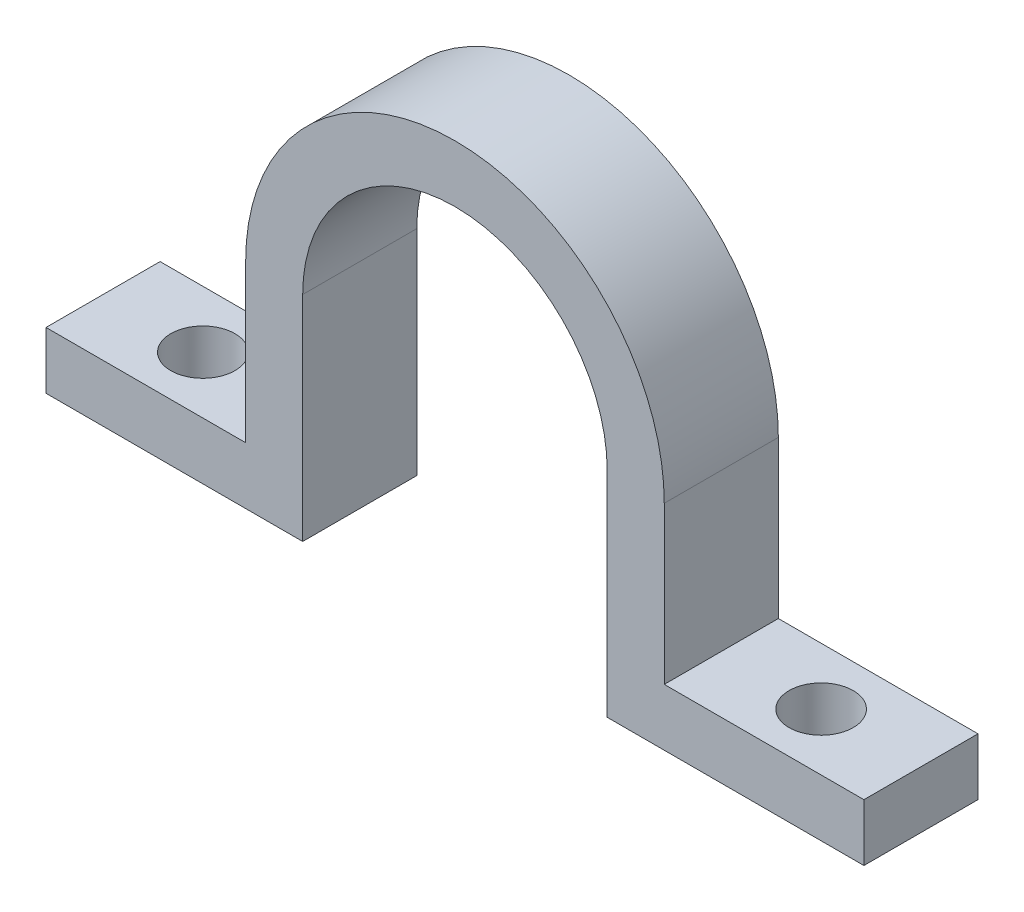
ISO-10303-21;
HEADER;
FILE_DESCRIPTION(('STEP AP214'),'2;1');
FILE_NAME('part.step','',(''),(''),'','','');
FILE_SCHEMA(('AUTOMOTIVE_DESIGN { 1 0 10303 214 1 1 1 1 }'));
ENDSEC;
DATA;
#1=APPLICATION_CONTEXT('core data for automotive mechanical design processes');
#2=APPLICATION_PROTOCOL_DEFINITION('international standard','automotive_design',2000,#1);
#3=PRODUCT_CONTEXT('',#1,'mechanical');
#4=PRODUCT('Part','Part','',(#3));
#5=PRODUCT_RELATED_PRODUCT_CATEGORY('part','',(#4));
#6=PRODUCT_DEFINITION_FORMATION('','',#4);
#7=PRODUCT_DEFINITION_CONTEXT('part definition',#1,'design');
#8=PRODUCT_DEFINITION('design','',#6,#7);
#9=PRODUCT_DEFINITION_SHAPE('','',#8);
#10=(LENGTH_UNIT() NAMED_UNIT(*) SI_UNIT(.MILLI.,.METRE.));
#11=(NAMED_UNIT(*) PLANE_ANGLE_UNIT() SI_UNIT($,.RADIAN.));
#12=(NAMED_UNIT(*) SI_UNIT($,.STERADIAN.) SOLID_ANGLE_UNIT());
#13=UNCERTAINTY_MEASURE_WITH_UNIT(LENGTH_MEASURE(1.E-05),#10,'distance_accuracy_value','');
#14=(GEOMETRIC_REPRESENTATION_CONTEXT(3) GLOBAL_UNCERTAINTY_ASSIGNED_CONTEXT((#13)) GLOBAL_UNIT_ASSIGNED_CONTEXT((#10,
#11,#12)) REPRESENTATION_CONTEXT('',''));
#15=CARTESIAN_POINT('',(0.,0.,0.));
#16=DIRECTION('',(0.,0.,1.));
#17=DIRECTION('',(1.,0.,0.));
#18=AXIS2_PLACEMENT_3D('',#15,#16,#17);
#19=CARTESIAN_POINT('',(-28.6775,4.,4.));
#20=DIRECTION('',(1.,0.,0.));
#21=DIRECTION('',(0.,0.,-1.));
#22=AXIS2_PLACEMENT_3D('',#19,#20,#21);
#23=PLANE('',#22);
#24=DIRECTION('',(0.,-1.,0.));
#25=VECTOR('',#24,1.);
#26=CARTESIAN_POINT('',(-28.6775,4.,-4.));
#27=LINE('',#26,#25);
#28=CARTESIAN_POINT('',(-28.6775,4.,-4.));
#29=VERTEX_POINT('',#28);
#30=CARTESIAN_POINT('',(-28.6775,0.,-4.));
#31=VERTEX_POINT('',#30);
#32=EDGE_CURVE('E175',#29,#31,#27,.T.);
#33=ORIENTED_EDGE('',*,*,#32,.T.);
#34=DIRECTION('',(0.,0.,-1.));
#35=VECTOR('',#34,1.);
#36=CARTESIAN_POINT('',(-28.6775,0.,4.));
#37=LINE('',#36,#35);
#38=CARTESIAN_POINT('',(-28.6775,0.,4.));
#39=VERTEX_POINT('',#38);
#40=EDGE_CURVE('E11',#39,#31,#37,.T.);
#41=ORIENTED_EDGE('',*,*,#40,.F.);
#42=DIRECTION('',(0.,-1.,0.));
#43=VECTOR('',#42,1.);
#44=CARTESIAN_POINT('',(-28.6775,4.,4.));
#45=LINE('',#44,#43);
#46=CARTESIAN_POINT('',(-28.6775,4.,4.));
#47=VERTEX_POINT('',#46);
#48=EDGE_CURVE('E210',#47,#39,#45,.T.);
#49=ORIENTED_EDGE('',*,*,#48,.F.);
#50=DIRECTION('',(0.,0.,-1.));
#51=VECTOR('',#50,1.);
#52=CARTESIAN_POINT('',(-28.6775,4.,4.));
#53=LINE('',#52,#51);
#54=EDGE_CURVE('E169',#47,#29,#53,.T.);
#55=ORIENTED_EDGE('',*,*,#54,.T.);
#56=EDGE_LOOP('',(#33,#41,#49,#55));
#57=FACE_BOUND('',#56,.T.);
#58=ADVANCED_FACE('F44',(#57),#23,.F.);
#59=CARTESIAN_POINT('',(-28.6775,0.,4.));
#60=DIRECTION('',(0.,1.,0.));
#61=DIRECTION('',(0.,0.,1.));
#62=AXIS2_PLACEMENT_3D('',#59,#60,#61);
#63=PLANE('',#62);
#64=CARTESIAN_POINT('',(-21.6775,0.,0.));
#65=DIRECTION('',(0.,1.,0.));
#66=DIRECTION('',(0.,0.,1.));
#67=AXIS2_PLACEMENT_3D('',#64,#65,#66);
#68=CIRCLE('',#67,2.25);
#69=CARTESIAN_POINT('',(-21.6775,0.,2.25));
#70=VERTEX_POINT('',#69);
#71=EDGE_CURVE('E242',#70,#70,#68,.F.);
#72=ORIENTED_EDGE('',*,*,#71,.F.);
#73=EDGE_LOOP('',(#72));
#74=FACE_BOUND('',#73,.T.);
#75=DIRECTION('',(1.,0.,0.));
#76=VECTOR('',#75,1.);
#77=CARTESIAN_POINT('',(-28.6775,0.,-4.));
#78=LINE('',#77,#76);
#79=CARTESIAN_POINT('',(-10.6775,0.,-4.));
#80=VERTEX_POINT('',#79);
#81=EDGE_CURVE('E177',#31,#80,#78,.T.);
#82=ORIENTED_EDGE('',*,*,#81,.T.);
#83=DIRECTION('',(0.,0.,-1.));
#84=VECTOR('',#83,1.);
#85=CARTESIAN_POINT('',(-10.6775,0.,4.));
#86=LINE('',#85,#84);
#87=CARTESIAN_POINT('',(-10.6775,0.,4.));
#88=VERTEX_POINT('',#87);
#89=EDGE_CURVE('E54',#88,#80,#86,.T.);
#90=ORIENTED_EDGE('',*,*,#89,.F.);
#91=DIRECTION('',(1.,0.,0.));
#92=VECTOR('',#91,1.);
#93=CARTESIAN_POINT('',(-28.6775,0.,4.));
#94=LINE('',#93,#92);
#95=EDGE_CURVE('E118',#39,#88,#94,.T.);
#96=ORIENTED_EDGE('',*,*,#95,.F.);
#97=ORIENTED_EDGE('',*,*,#40,.T.);
#98=EDGE_LOOP('',(#82,#90,#96,#97));
#99=FACE_BOUND('',#98,.T.);
#100=ADVANCED_FACE('F309',(#74,#99),#63,.F.);
#101=CARTESIAN_POINT('',(-10.6775,0.,4.));
#102=DIRECTION('',(-1.,0.,0.));
#103=DIRECTION('',(0.,0.,1.));
#104=AXIS2_PLACEMENT_3D('',#101,#102,#103);
#105=PLANE('',#104);
#106=DIRECTION('',(0.,1.,0.));
#107=VECTOR('',#106,1.);
#108=CARTESIAN_POINT('',(-10.6775,0.,-4.));
#109=LINE('',#108,#107);
#110=CARTESIAN_POINT('',(-10.6775,15.,-4.));
#111=VERTEX_POINT('',#110);
#112=EDGE_CURVE('E178',#80,#111,#109,.T.);
#113=ORIENTED_EDGE('',*,*,#112,.T.);
#114=DIRECTION('',(0.,0.,-1.));
#115=VECTOR('',#114,1.);
#116=CARTESIAN_POINT('',(-10.6775,15.,4.));
#117=LINE('',#116,#115);
#118=CARTESIAN_POINT('',(-10.6775,15.,4.));
#119=VERTEX_POINT('',#118);
#120=EDGE_CURVE('E231',#119,#111,#117,.T.);
#121=ORIENTED_EDGE('',*,*,#120,.F.);
#122=DIRECTION('',(0.,1.,0.));
#123=VECTOR('',#122,1.);
#124=CARTESIAN_POINT('',(-10.6775,0.,4.));
#125=LINE('',#124,#123);
#126=EDGE_CURVE('E261',#88,#119,#125,.T.);
#127=ORIENTED_EDGE('',*,*,#126,.F.);
#128=ORIENTED_EDGE('',*,*,#89,.T.);
#129=EDGE_LOOP('',(#113,#121,#127,#128));
#130=FACE_BOUND('',#129,.T.);
#131=ADVANCED_FACE('F312',(#130),#105,.F.);
#132=CARTESIAN_POINT('',(0.,15.,4.));
#133=DIRECTION('',(0.,0.,-1.));
#134=DIRECTION('',(-1.,0.,0.));
#135=AXIS2_PLACEMENT_3D('',#132,#133,#134);
#136=CYLINDRICAL_SURFACE('',#135,10.6775);
#137=CARTESIAN_POINT('',(0.,15.,-4.));
#138=DIRECTION('',(0.,0.,-1.));
#139=DIRECTION('',(-1.,0.,0.));
#140=AXIS2_PLACEMENT_3D('',#137,#138,#139);
#141=CIRCLE('',#140,10.6775);
#142=CARTESIAN_POINT('',(10.6775,15.,-4.));
#143=VERTEX_POINT('',#142);
#144=EDGE_CURVE('E181',#111,#143,#141,.T.);
#145=ORIENTED_EDGE('',*,*,#144,.T.);
#146=DIRECTION('',(0.,0.,-1.));
#147=VECTOR('',#146,1.);
#148=CARTESIAN_POINT('',(10.6775,15.,4.));
#149=LINE('',#148,#147);
#150=CARTESIAN_POINT('',(10.6775,15.,4.));
#151=VERTEX_POINT('',#150);
#152=EDGE_CURVE('E229',#151,#143,#149,.T.);
#153=ORIENTED_EDGE('',*,*,#152,.F.);
#154=CARTESIAN_POINT('',(0.,15.,4.));
#155=DIRECTION('',(0.,0.,-1.));
#156=DIRECTION('',(-1.,0.,0.));
#157=AXIS2_PLACEMENT_3D('',#154,#155,#156);
#158=CIRCLE('',#157,10.6775);
#159=EDGE_CURVE('E262',#119,#151,#158,.T.);
#160=ORIENTED_EDGE('',*,*,#159,.F.);
#161=ORIENTED_EDGE('',*,*,#120,.T.);
#162=EDGE_LOOP('',(#145,#153,#160,#161));
#163=FACE_BOUND('',#162,.T.);
#164=ADVANCED_FACE('F321',(#163),#136,.F.);
#165=CARTESIAN_POINT('',(10.6775,15.,4.));
#166=DIRECTION('',(1.,0.,0.));
#167=DIRECTION('',(0.,0.,-1.));
#168=AXIS2_PLACEMENT_3D('',#165,#166,#167);
#169=PLANE('',#168);
#170=DIRECTION('',(0.,-1.,0.));
#171=VECTOR('',#170,1.);
#172=CARTESIAN_POINT('',(10.6775,15.,-4.));
#173=LINE('',#172,#171);
#174=CARTESIAN_POINT('',(10.6775,0.,-4.));
#175=VERTEX_POINT('',#174);
#176=EDGE_CURVE('E186',#143,#175,#173,.T.);
#177=ORIENTED_EDGE('',*,*,#176,.T.);
#178=DIRECTION('',(0.,0.,-1.));
#179=VECTOR('',#178,1.);
#180=CARTESIAN_POINT('',(10.6775,0.,4.));
#181=LINE('',#180,#179);
#182=CARTESIAN_POINT('',(10.6775,0.,4.));
#183=VERTEX_POINT('',#182);
#184=EDGE_CURVE('E226',#183,#175,#181,.T.);
#185=ORIENTED_EDGE('',*,*,#184,.F.);
#186=DIRECTION('',(0.,-1.,0.));
#187=VECTOR('',#186,1.);
#188=CARTESIAN_POINT('',(10.6775,15.,4.));
#189=LINE('',#188,#187);
#190=EDGE_CURVE('E270',#151,#183,#189,.T.);
#191=ORIENTED_EDGE('',*,*,#190,.F.);
#192=ORIENTED_EDGE('',*,*,#152,.T.);
#193=EDGE_LOOP('',(#177,#185,#191,#192));
#194=FACE_BOUND('',#193,.T.);
#195=ADVANCED_FACE('F330',(#194),#169,.F.);
#196=CARTESIAN_POINT('',(10.6775,0.,4.));
#197=DIRECTION('',(0.,1.,0.));
#198=DIRECTION('',(0.,0.,1.));
#199=AXIS2_PLACEMENT_3D('',#196,#197,#198);
#200=PLANE('',#199);
#201=CARTESIAN_POINT('',(21.6775,0.,0.));
#202=DIRECTION('',(0.,1.,0.));
#203=DIRECTION('',(0.,0.,1.));
#204=AXIS2_PLACEMENT_3D('',#201,#202,#203);
#205=CIRCLE('',#204,2.25);
#206=CARTESIAN_POINT('',(21.6775,0.,2.25));
#207=VERTEX_POINT('',#206);
#208=EDGE_CURVE('E180',#207,#207,#205,.F.);
#209=ORIENTED_EDGE('',*,*,#208,.F.);
#210=EDGE_LOOP('',(#209));
#211=FACE_BOUND('',#210,.T.);
#212=DIRECTION('',(1.,0.,0.));
#213=VECTOR('',#212,1.);
#214=CARTESIAN_POINT('',(10.6775,0.,-4.));
#215=LINE('',#214,#213);
#216=CARTESIAN_POINT('',(28.6775,0.,-4.));
#217=VERTEX_POINT('',#216);
#218=EDGE_CURVE('E188',#175,#217,#215,.T.);
#219=ORIENTED_EDGE('',*,*,#218,.T.);
#220=DIRECTION('',(0.,0.,-1.));
#221=VECTOR('',#220,1.);
#222=CARTESIAN_POINT('',(28.6775,0.,4.));
#223=LINE('',#222,#221);
#224=CARTESIAN_POINT('',(28.6775,0.,4.));
#225=VERTEX_POINT('',#224);
#226=EDGE_CURVE('E225',#225,#217,#223,.T.);
#227=ORIENTED_EDGE('',*,*,#226,.F.);
#228=DIRECTION('',(1.,0.,0.));
#229=VECTOR('',#228,1.);
#230=CARTESIAN_POINT('',(10.6775,0.,4.));
#231=LINE('',#230,#229);
#232=EDGE_CURVE('E269',#183,#225,#231,.T.);
#233=ORIENTED_EDGE('',*,*,#232,.F.);
#234=ORIENTED_EDGE('',*,*,#184,.T.);
#235=EDGE_LOOP('',(#219,#227,#233,#234));
#236=FACE_BOUND('',#235,.T.);
#237=ADVANCED_FACE('F332',(#211,#236),#200,.F.);
#238=CARTESIAN_POINT('',(28.6775,0.,4.));
#239=DIRECTION('',(-1.,0.,0.));
#240=DIRECTION('',(0.,0.,1.));
#241=AXIS2_PLACEMENT_3D('',#238,#239,#240);
#242=PLANE('',#241);
#243=DIRECTION('',(0.,1.,0.));
#244=VECTOR('',#243,1.);
#245=CARTESIAN_POINT('',(28.6775,0.,-4.));
#246=LINE('',#245,#244);
#247=CARTESIAN_POINT('',(28.6775,4.,-4.));
#248=VERTEX_POINT('',#247);
#249=EDGE_CURVE('E195',#217,#248,#246,.T.);
#250=ORIENTED_EDGE('',*,*,#249,.T.);
#251=DIRECTION('',(0.,0.,-1.));
#252=VECTOR('',#251,1.);
#253=CARTESIAN_POINT('',(28.6775,4.,4.));
#254=LINE('',#253,#252);
#255=CARTESIAN_POINT('',(28.6775,4.,4.));
#256=VERTEX_POINT('',#255);
#257=EDGE_CURVE('E217',#256,#248,#254,.T.);
#258=ORIENTED_EDGE('',*,*,#257,.F.);
#259=DIRECTION('',(0.,1.,0.));
#260=VECTOR('',#259,1.);
#261=CARTESIAN_POINT('',(28.6775,0.,4.));
#262=LINE('',#261,#260);
#263=EDGE_CURVE('E272',#225,#256,#262,.T.);
#264=ORIENTED_EDGE('',*,*,#263,.F.);
#265=ORIENTED_EDGE('',*,*,#226,.T.);
#266=EDGE_LOOP('',(#250,#258,#264,#265));
#267=FACE_BOUND('',#266,.T.);
#268=ADVANCED_FACE('F331',(#267),#242,.F.);
#269=CARTESIAN_POINT('',(28.6775,4.,4.));
#270=DIRECTION('',(0.,-1.,0.));
#271=DIRECTION('',(0.,0.,-1.));
#272=AXIS2_PLACEMENT_3D('',#269,#270,#271);
#273=PLANE('',#272);
#274=CARTESIAN_POINT('',(21.6775,4.,0.));
#275=DIRECTION('',(0.,-1.,0.));
#276=DIRECTION('',(0.,0.,-1.));
#277=AXIS2_PLACEMENT_3D('',#274,#275,#276);
#278=CIRCLE('',#277,2.25);
#279=CARTESIAN_POINT('',(21.6775,4.,-2.25));
#280=VERTEX_POINT('',#279);
#281=EDGE_CURVE('E48',#280,#280,#278,.F.);
#282=ORIENTED_EDGE('',*,*,#281,.F.);
#283=EDGE_LOOP('',(#282));
#284=FACE_BOUND('',#283,.T.);
#285=DIRECTION('',(-1.,0.,0.));
#286=VECTOR('',#285,1.);
#287=CARTESIAN_POINT('',(28.6775,4.,-4.));
#288=LINE('',#287,#286);
#289=CARTESIAN_POINT('',(14.6775,4.,-4.));
#290=VERTEX_POINT('',#289);
#291=EDGE_CURVE('E193',#248,#290,#288,.T.);
#292=ORIENTED_EDGE('',*,*,#291,.T.);
#293=DIRECTION('',(0.,0.,-1.));
#294=VECTOR('',#293,1.);
#295=CARTESIAN_POINT('',(14.6775,4.,4.));
#296=LINE('',#295,#294);
#297=CARTESIAN_POINT('',(14.6775,4.,4.));
#298=VERTEX_POINT('',#297);
#299=EDGE_CURVE('E212',#298,#290,#296,.T.);
#300=ORIENTED_EDGE('',*,*,#299,.F.);
#301=DIRECTION('',(-1.,0.,0.));
#302=VECTOR('',#301,1.);
#303=CARTESIAN_POINT('',(28.6775,4.,4.));
#304=LINE('',#303,#302);
#305=EDGE_CURVE('E277',#256,#298,#304,.T.);
#306=ORIENTED_EDGE('',*,*,#305,.F.);
#307=ORIENTED_EDGE('',*,*,#257,.T.);
#308=EDGE_LOOP('',(#292,#300,#306,#307));
#309=FACE_BOUND('',#308,.T.);
#310=ADVANCED_FACE('F283',(#284,#309),#273,.F.);
#311=CARTESIAN_POINT('',(14.6775,4.,4.));
#312=DIRECTION('',(-1.,0.,0.));
#313=DIRECTION('',(0.,0.,1.));
#314=AXIS2_PLACEMENT_3D('',#311,#312,#313);
#315=PLANE('',#314);
#316=DIRECTION('',(0.,1.,0.));
#317=VECTOR('',#316,1.);
#318=CARTESIAN_POINT('',(14.6775,4.,-4.));
#319=LINE('',#318,#317);
#320=CARTESIAN_POINT('',(14.6775,15.,-4.));
#321=VERTEX_POINT('',#320);
#322=EDGE_CURVE('E196',#290,#321,#319,.T.);
#323=ORIENTED_EDGE('',*,*,#322,.T.);
#324=DIRECTION('',(0.,0.,-1.));
#325=VECTOR('',#324,1.);
#326=CARTESIAN_POINT('',(14.6775,15.,4.));
#327=LINE('',#326,#325);
#328=CARTESIAN_POINT('',(14.6775,15.,4.));
#329=VERTEX_POINT('',#328);
#330=EDGE_CURVE('E161',#329,#321,#327,.T.);
#331=ORIENTED_EDGE('',*,*,#330,.F.);
#332=DIRECTION('',(0.,1.,0.));
#333=VECTOR('',#332,1.);
#334=CARTESIAN_POINT('',(14.6775,4.,4.));
#335=LINE('',#334,#333);
#336=EDGE_CURVE('E147',#298,#329,#335,.T.);
#337=ORIENTED_EDGE('',*,*,#336,.F.);
#338=ORIENTED_EDGE('',*,*,#299,.T.);
#339=EDGE_LOOP('',(#323,#331,#337,#338));
#340=FACE_BOUND('',#339,.T.);
#341=ADVANCED_FACE('F289',(#340),#315,.F.);
#342=CARTESIAN_POINT('',(0.,15.,4.));
#343=DIRECTION('',(0.,0.,-1.));
#344=DIRECTION('',(-1.,0.,0.));
#345=AXIS2_PLACEMENT_3D('',#342,#343,#344);
#346=CYLINDRICAL_SURFACE('',#345,14.6775);
#347=CARTESIAN_POINT('',(0.,15.,-4.));
#348=DIRECTION('',(0.,0.,1.));
#349=DIRECTION('',(1.,0.,0.));
#350=AXIS2_PLACEMENT_3D('',#347,#348,#349);
#351=CIRCLE('',#350,14.6775);
#352=CARTESIAN_POINT('',(-14.6775,15.,-4.));
#353=VERTEX_POINT('',#352);
#354=EDGE_CURVE('E157',#321,#353,#351,.T.);
#355=ORIENTED_EDGE('',*,*,#354,.T.);
#356=DIRECTION('',(0.,0.,-1.));
#357=VECTOR('',#356,1.);
#358=CARTESIAN_POINT('',(-14.6775,15.,4.));
#359=LINE('',#358,#357);
#360=CARTESIAN_POINT('',(-14.6775,15.,4.));
#361=VERTEX_POINT('',#360);
#362=EDGE_CURVE('E156',#361,#353,#359,.T.);
#363=ORIENTED_EDGE('',*,*,#362,.F.);
#364=CARTESIAN_POINT('',(0.,15.,4.));
#365=DIRECTION('',(0.,0.,1.));
#366=DIRECTION('',(1.,0.,0.));
#367=AXIS2_PLACEMENT_3D('',#364,#365,#366);
#368=CIRCLE('',#367,14.6775);
#369=EDGE_CURVE('E145',#329,#361,#368,.T.);
#370=ORIENTED_EDGE('',*,*,#369,.F.);
#371=ORIENTED_EDGE('',*,*,#330,.T.);
#372=EDGE_LOOP('',(#355,#363,#370,#371));
#373=FACE_BOUND('',#372,.T.);
#374=ADVANCED_FACE('F160',(#373),#346,.T.);
#375=CARTESIAN_POINT('',(-14.6775,15.,4.));
#376=DIRECTION('',(1.,0.,0.));
#377=DIRECTION('',(0.,0.,-1.));
#378=AXIS2_PLACEMENT_3D('',#375,#376,#377);
#379=PLANE('',#378);
#380=DIRECTION('',(0.,-1.,0.));
#381=VECTOR('',#380,1.);
#382=CARTESIAN_POINT('',(-14.6775,15.,-4.));
#383=LINE('',#382,#381);
#384=CARTESIAN_POINT('',(-14.6775,4.,-4.));
#385=VERTEX_POINT('',#384);
#386=EDGE_CURVE('E104',#353,#385,#383,.T.);
#387=ORIENTED_EDGE('',*,*,#386,.T.);
#388=DIRECTION('',(0.,0.,-1.));
#389=VECTOR('',#388,1.);
#390=CARTESIAN_POINT('',(-14.6775,4.,4.));
#391=LINE('',#390,#389);
#392=CARTESIAN_POINT('',(-14.6775,4.,4.));
#393=VERTEX_POINT('',#392);
#394=EDGE_CURVE('E165',#393,#385,#391,.T.);
#395=ORIENTED_EDGE('',*,*,#394,.F.);
#396=DIRECTION('',(0.,-1.,0.));
#397=VECTOR('',#396,1.);
#398=CARTESIAN_POINT('',(-14.6775,15.,4.));
#399=LINE('',#398,#397);
#400=EDGE_CURVE('E146',#361,#393,#399,.T.);
#401=ORIENTED_EDGE('',*,*,#400,.F.);
#402=ORIENTED_EDGE('',*,*,#362,.T.);
#403=EDGE_LOOP('',(#387,#395,#401,#402));
#404=FACE_BOUND('',#403,.T.);
#405=ADVANCED_FACE('F163',(#404),#379,.F.);
#406=CARTESIAN_POINT('',(-14.6775,4.,4.));
#407=DIRECTION('',(0.,-1.,0.));
#408=DIRECTION('',(0.,0.,-1.));
#409=AXIS2_PLACEMENT_3D('',#406,#407,#408);
#410=PLANE('',#409);
#411=CARTESIAN_POINT('',(-21.6775,4.,0.));
#412=DIRECTION('',(0.,-1.,0.));
#413=DIRECTION('',(0.,0.,-1.));
#414=AXIS2_PLACEMENT_3D('',#411,#412,#413);
#415=CIRCLE('',#414,2.25);
#416=CARTESIAN_POINT('',(-21.6775,4.,-2.25));
#417=VERTEX_POINT('',#416);
#418=EDGE_CURVE('E238',#417,#417,#415,.F.);
#419=ORIENTED_EDGE('',*,*,#418,.F.);
#420=EDGE_LOOP('',(#419));
#421=FACE_BOUND('',#420,.T.);
#422=DIRECTION('',(-1.,0.,0.));
#423=VECTOR('',#422,1.);
#424=CARTESIAN_POINT('',(-14.6775,4.,-4.));
#425=LINE('',#424,#423);
#426=EDGE_CURVE('E112',#385,#29,#425,.T.);
#427=ORIENTED_EDGE('',*,*,#426,.T.);
#428=ORIENTED_EDGE('',*,*,#54,.F.);
#429=DIRECTION('',(-1.,0.,0.));
#430=VECTOR('',#429,1.);
#431=CARTESIAN_POINT('',(-14.6775,4.,4.));
#432=LINE('',#431,#430);
#433=EDGE_CURVE('E63',#393,#47,#432,.T.);
#434=ORIENTED_EDGE('',*,*,#433,.F.);
#435=ORIENTED_EDGE('',*,*,#394,.T.);
#436=EDGE_LOOP('',(#427,#428,#434,#435));
#437=FACE_BOUND('',#436,.T.);
#438=ADVANCED_FACE('F296',(#421,#437),#410,.F.);
#439=CARTESIAN_POINT('',(0.,15.,4.));
#440=DIRECTION('',(0.,0.,-1.));
#441=DIRECTION('',(-1.,0.,0.));
#442=AXIS2_PLACEMENT_3D('',#439,#440,#441);
#443=PLANE('',#442);
#444=ORIENTED_EDGE('',*,*,#48,.T.);
#445=ORIENTED_EDGE('',*,*,#95,.T.);
#446=ORIENTED_EDGE('',*,*,#126,.T.);
#447=ORIENTED_EDGE('',*,*,#159,.T.);
#448=ORIENTED_EDGE('',*,*,#190,.T.);
#449=ORIENTED_EDGE('',*,*,#232,.T.);
#450=ORIENTED_EDGE('',*,*,#263,.T.);
#451=ORIENTED_EDGE('',*,*,#305,.T.);
#452=ORIENTED_EDGE('',*,*,#336,.T.);
#453=ORIENTED_EDGE('',*,*,#369,.T.);
#454=ORIENTED_EDGE('',*,*,#400,.T.);
#455=ORIENTED_EDGE('',*,*,#433,.T.);
#456=EDGE_LOOP('',(#444,#445,#446,#447,#448,#449,#450,#451,#452,#453,#454,#455));
#457=FACE_BOUND('',#456,.T.);
#458=ADVANCED_FACE('F148',(#457),#443,.F.);
#459=CARTESIAN_POINT('',(0.,15.,-4.));
#460=DIRECTION('',(0.,0.,-1.));
#461=DIRECTION('',(-1.,0.,0.));
#462=AXIS2_PLACEMENT_3D('',#459,#460,#461);
#463=PLANE('',#462);
#464=ORIENTED_EDGE('',*,*,#32,.F.);
#465=ORIENTED_EDGE('',*,*,#426,.F.);
#466=ORIENTED_EDGE('',*,*,#386,.F.);
#467=ORIENTED_EDGE('',*,*,#354,.F.);
#468=ORIENTED_EDGE('',*,*,#322,.F.);
#469=ORIENTED_EDGE('',*,*,#291,.F.);
#470=ORIENTED_EDGE('',*,*,#249,.F.);
#471=ORIENTED_EDGE('',*,*,#218,.F.);
#472=ORIENTED_EDGE('',*,*,#176,.F.);
#473=ORIENTED_EDGE('',*,*,#144,.F.);
#474=ORIENTED_EDGE('',*,*,#112,.F.);
#475=ORIENTED_EDGE('',*,*,#81,.F.);
#476=EDGE_LOOP('',(#464,#465,#466,#467,#468,#469,#470,#471,#472,#473,#474,#475));
#477=FACE_BOUND('',#476,.T.);
#478=ADVANCED_FACE('F292',(#477),#463,.T.);
#479=CARTESIAN_POINT('',(-21.6775,4.5,0.));
#480=DIRECTION('',(0.,-1.,0.));
#481=DIRECTION('',(0.,0.,-1.));
#482=AXIS2_PLACEMENT_3D('',#479,#480,#481);
#483=CYLINDRICAL_SURFACE('',#482,2.25);
#484=ORIENTED_EDGE('',*,*,#418,.T.);
#485=EDGE_LOOP('',(#484));
#486=FACE_BOUND('',#485,.T.);
#487=ORIENTED_EDGE('',*,*,#71,.T.);
#488=EDGE_LOOP('',(#487));
#489=FACE_BOUND('',#488,.T.);
#490=ADVANCED_FACE('F361',(#486,#489),#483,.F.);
#491=CARTESIAN_POINT('',(21.6775,4.5,0.));
#492=DIRECTION('',(0.,-1.,0.));
#493=DIRECTION('',(0.,0.,-1.));
#494=AXIS2_PLACEMENT_3D('',#491,#492,#493);
#495=CYLINDRICAL_SURFACE('',#494,2.25);
#496=ORIENTED_EDGE('',*,*,#281,.T.);
#497=EDGE_LOOP('',(#496));
#498=FACE_BOUND('',#497,.T.);
#499=ORIENTED_EDGE('',*,*,#208,.T.);
#500=EDGE_LOOP('',(#499));
#501=FACE_BOUND('',#500,.T.);
#502=ADVANCED_FACE('F373',(#498,#501),#495,.F.);
#503=CLOSED_SHELL('',(#58,#100,#131,#164,#195,#237,#268,#310,#341,#374,#405,#438,#458,#478,#490,#502));
#504=MANIFOLD_SOLID_BREP('B2',#503);
#505=ADVANCED_BREP_SHAPE_REPRESENTATION('',(#18,#504),#14);
#506=SHAPE_DEFINITION_REPRESENTATION(#9,#505);
ENDSEC;
END-ISO-10303-21;
